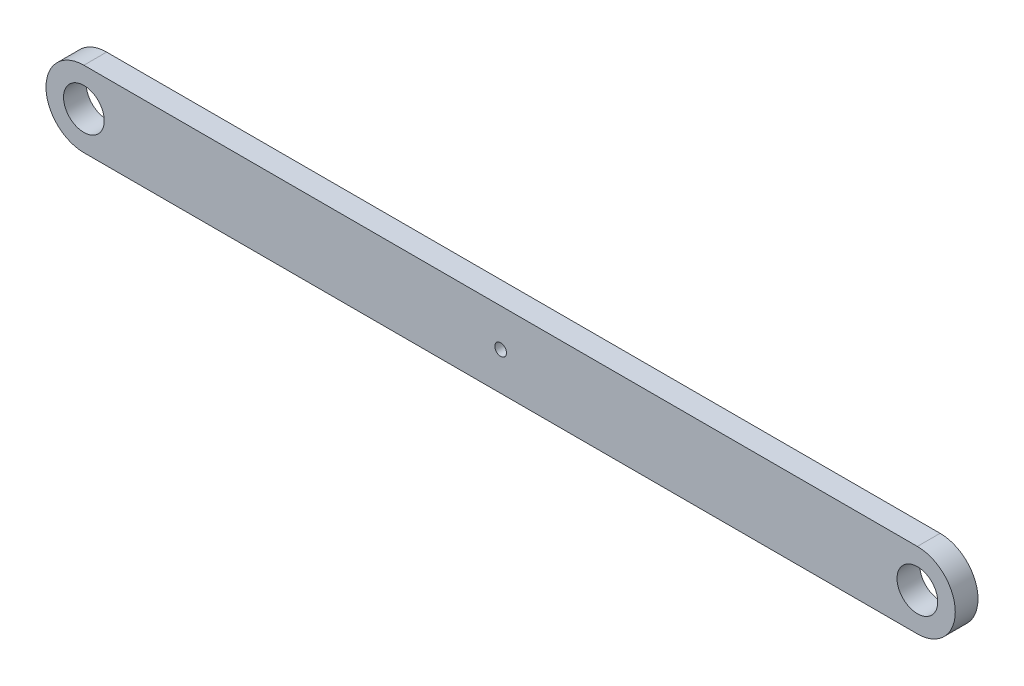
ISO-10303-21;
HEADER;
FILE_DESCRIPTION(('STEP AP214'),'2;1');
FILE_NAME('part.step','',(''),(''),'','','');
FILE_SCHEMA(('AUTOMOTIVE_DESIGN { 1 0 10303 214 1 1 1 1 }'));
ENDSEC;
DATA;
#1=APPLICATION_CONTEXT('core data for automotive mechanical design processes');
#2=APPLICATION_PROTOCOL_DEFINITION('international standard','automotive_design',2000,#1);
#3=PRODUCT_CONTEXT('',#1,'mechanical');
#4=PRODUCT('Part','Part','',(#3));
#5=PRODUCT_RELATED_PRODUCT_CATEGORY('part','',(#4));
#6=PRODUCT_DEFINITION_FORMATION('','',#4);
#7=PRODUCT_DEFINITION_CONTEXT('part definition',#1,'design');
#8=PRODUCT_DEFINITION('design','',#6,#7);
#9=PRODUCT_DEFINITION_SHAPE('','',#8);
#10=(LENGTH_UNIT() NAMED_UNIT(*) SI_UNIT(.MILLI.,.METRE.));
#11=(NAMED_UNIT(*) PLANE_ANGLE_UNIT() SI_UNIT($,.RADIAN.));
#12=(NAMED_UNIT(*) SI_UNIT($,.STERADIAN.) SOLID_ANGLE_UNIT());
#13=UNCERTAINTY_MEASURE_WITH_UNIT(LENGTH_MEASURE(1.E-05),#10,'distance_accuracy_value','');
#14=(GEOMETRIC_REPRESENTATION_CONTEXT(3) GLOBAL_UNCERTAINTY_ASSIGNED_CONTEXT((#13)) GLOBAL_UNIT_ASSIGNED_CONTEXT((#10,
#11,#12)) REPRESENTATION_CONTEXT('',''));
#15=CARTESIAN_POINT('',(0.,0.,0.));
#16=DIRECTION('',(0.,0.,1.));
#17=DIRECTION('',(1.,0.,0.));
#18=AXIS2_PLACEMENT_3D('',#15,#16,#17);
#19=CARTESIAN_POINT('',(0.,9.99999999999994,6.));
#20=DIRECTION('',(0.,0.,1.));
#21=DIRECTION('',(1.,0.,0.));
#22=AXIS2_PLACEMENT_3D('',#19,#20,#21);
#23=PLANE('',#22);
#24=CARTESIAN_POINT('',(220.,10.,6.));
#25=DIRECTION('',(0.,0.,1.));
#26=DIRECTION('',(1.,0.,0.));
#27=AXIS2_PLACEMENT_3D('',#24,#25,#26);
#28=CIRCLE('',#27,5.37499999999998);
#29=CARTESIAN_POINT('',(225.375,10.,6.));
#30=VERTEX_POINT('',#29);
#31=EDGE_CURVE('E136',#30,#30,#28,.T.);
#32=ORIENTED_EDGE('',*,*,#31,.F.);
#33=EDGE_LOOP('',(#32));
#34=FACE_BOUND('',#33,.T.);
#35=CARTESIAN_POINT('',(0.,9.99999999999994,6.));
#36=DIRECTION('',(0.,0.,1.));
#37=DIRECTION('',(1.,0.,0.));
#38=AXIS2_PLACEMENT_3D('',#35,#36,#37);
#39=CIRCLE('',#38,9.99999999999999);
#40=CARTESIAN_POINT('',(0.,20.,6.));
#41=VERTEX_POINT('',#40);
#42=CARTESIAN_POINT('',(0.,0.,6.));
#43=VERTEX_POINT('',#42);
#44=EDGE_CURVE('E94',#41,#43,#39,.T.);
#45=ORIENTED_EDGE('',*,*,#44,.T.);
#46=DIRECTION('',(1.,0.,0.));
#47=VECTOR('',#46,1.);
#48=CARTESIAN_POINT('',(0.,0.,6.));
#49=LINE('',#48,#47);
#50=CARTESIAN_POINT('',(220.,0.,6.));
#51=VERTEX_POINT('',#50);
#52=EDGE_CURVE('E89',#43,#51,#49,.T.);
#53=ORIENTED_EDGE('',*,*,#52,.T.);
#54=CARTESIAN_POINT('',(220.,10.,6.));
#55=DIRECTION('',(0.,0.,1.));
#56=DIRECTION('',(-1.,0.,0.));
#57=AXIS2_PLACEMENT_3D('',#54,#55,#56);
#58=CIRCLE('',#57,10.);
#59=CARTESIAN_POINT('',(220.,20.,6.));
#60=VERTEX_POINT('',#59);
#61=EDGE_CURVE('E92',#51,#60,#58,.T.);
#62=ORIENTED_EDGE('',*,*,#61,.T.);
#63=DIRECTION('',(-1.,0.,0.));
#64=VECTOR('',#63,1.);
#65=CARTESIAN_POINT('',(220.,20.,6.));
#66=LINE('',#65,#64);
#67=EDGE_CURVE('E59',#60,#41,#66,.T.);
#68=ORIENTED_EDGE('',*,*,#67,.T.);
#69=EDGE_LOOP('',(#45,#53,#62,#68));
#70=FACE_BOUND('',#69,.T.);
#71=CARTESIAN_POINT('',(0.,9.99999999999994,6.));
#72=DIRECTION('',(0.,0.,1.));
#73=DIRECTION('',(1.,0.,0.));
#74=AXIS2_PLACEMENT_3D('',#71,#72,#73);
#75=CIRCLE('',#74,5.375);
#76=CARTESIAN_POINT('',(5.375,9.99999999999994,6.));
#77=VERTEX_POINT('',#76);
#78=EDGE_CURVE('E114',#77,#77,#75,.T.);
#79=ORIENTED_EDGE('',*,*,#78,.F.);
#80=EDGE_LOOP('',(#79));
#81=FACE_BOUND('',#80,.T.);
#82=CARTESIAN_POINT('',(110.,9.99999999999997,6.));
#83=DIRECTION('',(0.,0.,1.));
#84=DIRECTION('',(1.,0.,0.));
#85=AXIS2_PLACEMENT_3D('',#82,#83,#84);
#86=CIRCLE('',#85,1.54999999999999);
#87=CARTESIAN_POINT('',(111.55,9.99999999999997,6.));
#88=VERTEX_POINT('',#87);
#89=EDGE_CURVE('E144',#88,#88,#86,.T.);
#90=ORIENTED_EDGE('',*,*,#89,.F.);
#91=EDGE_LOOP('',(#90));
#92=FACE_BOUND('',#91,.T.);
#93=ADVANCED_FACE('F41',(#34,#70,#81,#92),#23,.T.);
#94=CARTESIAN_POINT('',(0.,9.99999999999994,0.));
#95=DIRECTION('',(0.,0.,1.));
#96=DIRECTION('',(1.,0.,0.));
#97=AXIS2_PLACEMENT_3D('',#94,#95,#96);
#98=PLANE('',#97);
#99=CARTESIAN_POINT('',(0.,9.99999999999994,0.));
#100=DIRECTION('',(0.,0.,1.));
#101=DIRECTION('',(1.,0.,0.));
#102=AXIS2_PLACEMENT_3D('',#99,#100,#101);
#103=CIRCLE('',#102,9.99999999999999);
#104=CARTESIAN_POINT('',(0.,20.,0.));
#105=VERTEX_POINT('',#104);
#106=CARTESIAN_POINT('',(0.,0.,0.));
#107=VERTEX_POINT('',#106);
#108=EDGE_CURVE('E110',#105,#107,#103,.T.);
#109=ORIENTED_EDGE('',*,*,#108,.F.);
#110=DIRECTION('',(-1.,0.,0.));
#111=VECTOR('',#110,1.);
#112=CARTESIAN_POINT('',(220.,20.,0.));
#113=LINE('',#112,#111);
#114=CARTESIAN_POINT('',(220.,20.,0.));
#115=VERTEX_POINT('',#114);
#116=EDGE_CURVE('E82',#115,#105,#113,.T.);
#117=ORIENTED_EDGE('',*,*,#116,.F.);
#118=CARTESIAN_POINT('',(220.,10.,0.));
#119=DIRECTION('',(0.,0.,1.));
#120=DIRECTION('',(-1.,0.,0.));
#121=AXIS2_PLACEMENT_3D('',#118,#119,#120);
#122=CIRCLE('',#121,10.);
#123=CARTESIAN_POINT('',(220.,0.,0.));
#124=VERTEX_POINT('',#123);
#125=EDGE_CURVE('E76',#124,#115,#122,.T.);
#126=ORIENTED_EDGE('',*,*,#125,.F.);
#127=DIRECTION('',(1.,0.,0.));
#128=VECTOR('',#127,1.);
#129=CARTESIAN_POINT('',(0.,0.,0.));
#130=LINE('',#129,#128);
#131=EDGE_CURVE('E99',#107,#124,#130,.T.);
#132=ORIENTED_EDGE('',*,*,#131,.F.);
#133=EDGE_LOOP('',(#109,#117,#126,#132));
#134=FACE_BOUND('',#133,.T.);
#135=CARTESIAN_POINT('',(0.,9.99999999999994,0.));
#136=DIRECTION('',(0.,0.,1.));
#137=DIRECTION('',(1.,0.,0.));
#138=AXIS2_PLACEMENT_3D('',#135,#136,#137);
#139=CIRCLE('',#138,5.375);
#140=CARTESIAN_POINT('',(5.375,9.99999999999994,0.));
#141=VERTEX_POINT('',#140);
#142=EDGE_CURVE('E132',#141,#141,#139,.T.);
#143=ORIENTED_EDGE('',*,*,#142,.T.);
#144=EDGE_LOOP('',(#143));
#145=FACE_BOUND('',#144,.T.);
#146=CARTESIAN_POINT('',(220.,10.,0.));
#147=DIRECTION('',(0.,0.,1.));
#148=DIRECTION('',(1.,0.,0.));
#149=AXIS2_PLACEMENT_3D('',#146,#147,#148);
#150=CIRCLE('',#149,5.37499999999998);
#151=CARTESIAN_POINT('',(225.375,10.,0.));
#152=VERTEX_POINT('',#151);
#153=EDGE_CURVE('E140',#152,#152,#150,.T.);
#154=ORIENTED_EDGE('',*,*,#153,.T.);
#155=EDGE_LOOP('',(#154));
#156=FACE_BOUND('',#155,.T.);
#157=CARTESIAN_POINT('',(110.,9.99999999999997,0.));
#158=DIRECTION('',(0.,0.,1.));
#159=DIRECTION('',(1.,0.,0.));
#160=AXIS2_PLACEMENT_3D('',#157,#158,#159);
#161=CIRCLE('',#160,1.54999999999999);
#162=CARTESIAN_POINT('',(111.55,9.99999999999997,0.));
#163=VERTEX_POINT('',#162);
#164=EDGE_CURVE('E148',#163,#163,#161,.T.);
#165=ORIENTED_EDGE('',*,*,#164,.T.);
#166=EDGE_LOOP('',(#165));
#167=FACE_BOUND('',#166,.T.);
#168=ADVANCED_FACE('F127',(#134,#145,#156,#167),#98,.F.);
#169=CARTESIAN_POINT('',(0.,9.99999999999994,6.));
#170=DIRECTION('',(0.,0.,-1.));
#171=DIRECTION('',(-1.,0.,0.));
#172=AXIS2_PLACEMENT_3D('',#169,#170,#171);
#173=CYLINDRICAL_SURFACE('',#172,9.99999999999999);
#174=ORIENTED_EDGE('',*,*,#108,.T.);
#175=DIRECTION('',(0.,0.,-1.));
#176=VECTOR('',#175,1.);
#177=CARTESIAN_POINT('',(0.,0.,6.));
#178=LINE('',#177,#176);
#179=EDGE_CURVE('E11',#43,#107,#178,.T.);
#180=ORIENTED_EDGE('',*,*,#179,.F.);
#181=ORIENTED_EDGE('',*,*,#44,.F.);
#182=DIRECTION('',(0.,0.,-1.));
#183=VECTOR('',#182,1.);
#184=CARTESIAN_POINT('',(0.,20.,6.));
#185=LINE('',#184,#183);
#186=EDGE_CURVE('E106',#41,#105,#185,.T.);
#187=ORIENTED_EDGE('',*,*,#186,.T.);
#188=EDGE_LOOP('',(#174,#180,#181,#187));
#189=FACE_BOUND('',#188,.T.);
#190=ADVANCED_FACE('F43',(#189),#173,.T.);
#191=CARTESIAN_POINT('',(0.,0.,6.));
#192=DIRECTION('',(0.,1.,0.));
#193=DIRECTION('',(0.,0.,1.));
#194=AXIS2_PLACEMENT_3D('',#191,#192,#193);
#195=PLANE('',#194);
#196=ORIENTED_EDGE('',*,*,#131,.T.);
#197=DIRECTION('',(0.,0.,-1.));
#198=VECTOR('',#197,1.);
#199=CARTESIAN_POINT('',(220.,0.,6.));
#200=LINE('',#199,#198);
#201=EDGE_CURVE('E51',#51,#124,#200,.T.);
#202=ORIENTED_EDGE('',*,*,#201,.F.);
#203=ORIENTED_EDGE('',*,*,#52,.F.);
#204=ORIENTED_EDGE('',*,*,#179,.T.);
#205=EDGE_LOOP('',(#196,#202,#203,#204));
#206=FACE_BOUND('',#205,.T.);
#207=ADVANCED_FACE('F98',(#206),#195,.F.);
#208=CARTESIAN_POINT('',(220.,10.,6.));
#209=DIRECTION('',(0.,0.,-1.));
#210=DIRECTION('',(-1.,0.,0.));
#211=AXIS2_PLACEMENT_3D('',#208,#209,#210);
#212=CYLINDRICAL_SURFACE('',#211,10.);
#213=ORIENTED_EDGE('',*,*,#125,.T.);
#214=DIRECTION('',(0.,0.,-1.));
#215=VECTOR('',#214,1.);
#216=CARTESIAN_POINT('',(220.,20.,6.));
#217=LINE('',#216,#215);
#218=EDGE_CURVE('E101',#60,#115,#217,.T.);
#219=ORIENTED_EDGE('',*,*,#218,.F.);
#220=ORIENTED_EDGE('',*,*,#61,.F.);
#221=ORIENTED_EDGE('',*,*,#201,.T.);
#222=EDGE_LOOP('',(#213,#219,#220,#221));
#223=FACE_BOUND('',#222,.T.);
#224=ADVANCED_FACE('F102',(#223),#212,.T.);
#225=CARTESIAN_POINT('',(220.,20.,6.));
#226=DIRECTION('',(0.,-1.,0.));
#227=DIRECTION('',(1.,0.,0.));
#228=AXIS2_PLACEMENT_3D('',#225,#226,#227);
#229=PLANE('',#228);
#230=ORIENTED_EDGE('',*,*,#116,.T.);
#231=ORIENTED_EDGE('',*,*,#186,.F.);
#232=ORIENTED_EDGE('',*,*,#67,.F.);
#233=ORIENTED_EDGE('',*,*,#218,.T.);
#234=EDGE_LOOP('',(#230,#231,#232,#233));
#235=FACE_BOUND('',#234,.T.);
#236=ADVANCED_FACE('F124',(#235),#229,.F.);
#237=CARTESIAN_POINT('',(0.,9.99999999999994,6.));
#238=DIRECTION('',(0.,0.,-1.));
#239=DIRECTION('',(-1.,0.,0.));
#240=AXIS2_PLACEMENT_3D('',#237,#238,#239);
#241=CYLINDRICAL_SURFACE('',#240,5.375);
#242=ORIENTED_EDGE('',*,*,#78,.T.);
#243=EDGE_LOOP('',(#242));
#244=FACE_BOUND('',#243,.T.);
#245=ORIENTED_EDGE('',*,*,#142,.F.);
#246=EDGE_LOOP('',(#245));
#247=FACE_BOUND('',#246,.T.);
#248=ADVANCED_FACE('F168',(#244,#247),#241,.F.);
#249=CARTESIAN_POINT('',(220.,10.,6.));
#250=DIRECTION('',(0.,0.,-1.));
#251=DIRECTION('',(-1.,0.,0.));
#252=AXIS2_PLACEMENT_3D('',#249,#250,#251);
#253=CYLINDRICAL_SURFACE('',#252,5.37499999999998);
#254=ORIENTED_EDGE('',*,*,#31,.T.);
#255=EDGE_LOOP('',(#254));
#256=FACE_BOUND('',#255,.T.);
#257=ORIENTED_EDGE('',*,*,#153,.F.);
#258=EDGE_LOOP('',(#257));
#259=FACE_BOUND('',#258,.T.);
#260=ADVANCED_FACE('F223',(#256,#259),#253,.F.);
#261=CARTESIAN_POINT('',(110.,9.99999999999997,6.));
#262=DIRECTION('',(0.,0.,-1.));
#263=DIRECTION('',(-1.,0.,0.));
#264=AXIS2_PLACEMENT_3D('',#261,#262,#263);
#265=CYLINDRICAL_SURFACE('',#264,1.54999999999999);
#266=ORIENTED_EDGE('',*,*,#89,.T.);
#267=EDGE_LOOP('',(#266));
#268=FACE_BOUND('',#267,.T.);
#269=ORIENTED_EDGE('',*,*,#164,.F.);
#270=EDGE_LOOP('',(#269));
#271=FACE_BOUND('',#270,.T.);
#272=ADVANCED_FACE('F156',(#268,#271),#265,.F.);
#273=CLOSED_SHELL('',(#93,#168,#190,#207,#224,#236,#248,#260,#272));
#274=MANIFOLD_SOLID_BREP('B2',#273);
#275=ADVANCED_BREP_SHAPE_REPRESENTATION('',(#18,#274),#14);
#276=SHAPE_DEFINITION_REPRESENTATION(#9,#275);
ENDSEC;
END-ISO-10303-21;
